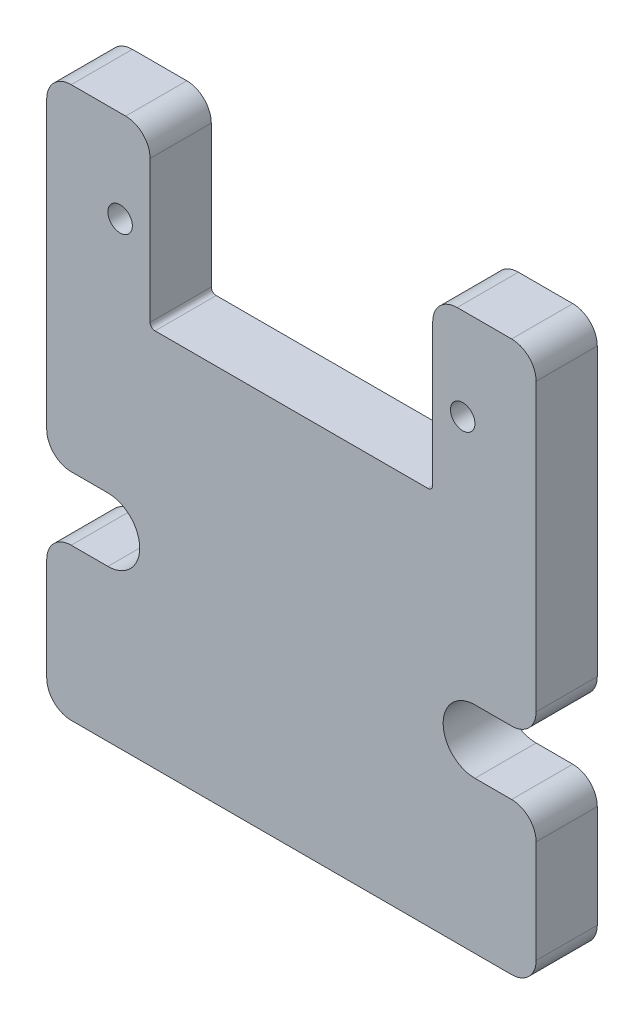
ISO-10303-21;
HEADER;
FILE_DESCRIPTION(('STEP AP214'),'2;1');
FILE_NAME('part.step','',(''),(''),'','','');
FILE_SCHEMA(('AUTOMOTIVE_DESIGN { 1 0 10303 214 1 1 1 1 }'));
ENDSEC;
DATA;
#1=APPLICATION_CONTEXT('core data for automotive mechanical design processes');
#2=APPLICATION_PROTOCOL_DEFINITION('international standard','automotive_design',2000,#1);
#3=PRODUCT_CONTEXT('',#1,'mechanical');
#4=PRODUCT('Part','Part','',(#3));
#5=PRODUCT_RELATED_PRODUCT_CATEGORY('part','',(#4));
#6=PRODUCT_DEFINITION_FORMATION('','',#4);
#7=PRODUCT_DEFINITION_CONTEXT('part definition',#1,'design');
#8=PRODUCT_DEFINITION('design','',#6,#7);
#9=PRODUCT_DEFINITION_SHAPE('','',#8);
#10=(LENGTH_UNIT() NAMED_UNIT(*) SI_UNIT(.MILLI.,.METRE.));
#11=(NAMED_UNIT(*) PLANE_ANGLE_UNIT() SI_UNIT($,.RADIAN.));
#12=(NAMED_UNIT(*) SI_UNIT($,.STERADIAN.) SOLID_ANGLE_UNIT());
#13=UNCERTAINTY_MEASURE_WITH_UNIT(LENGTH_MEASURE(1.E-05),#10,'distance_accuracy_value','');
#14=(GEOMETRIC_REPRESENTATION_CONTEXT(3) GLOBAL_UNCERTAINTY_ASSIGNED_CONTEXT((#13)) GLOBAL_UNIT_ASSIGNED_CONTEXT((#10,
#11,#12)) REPRESENTATION_CONTEXT('',''));
#15=CARTESIAN_POINT('',(0.,0.,0.));
#16=DIRECTION('',(0.,0.,1.));
#17=DIRECTION('',(1.,0.,0.));
#18=AXIS2_PLACEMENT_3D('',#15,#16,#17);
#19=CARTESIAN_POINT('',(40.,0.,5.));
#20=DIRECTION('',(-1.,0.,0.));
#21=DIRECTION('',(0.,-1.,0.));
#22=AXIS2_PLACEMENT_3D('',#19,#20,#21);
#23=PLANE('',#22);
#24=DIRECTION('',(0.,1.,0.));
#25=VECTOR('',#24,1.);
#26=CARTESIAN_POINT('',(40.,0.,0.));
#27=LINE('',#26,#25);
#28=CARTESIAN_POINT('',(40.,34.6,0.));
#29=VERTEX_POINT('',#28);
#30=CARTESIAN_POINT('',(40.,58.,0.));
#31=VERTEX_POINT('',#30);
#32=EDGE_CURVE('E276',#29,#31,#27,.T.);
#33=ORIENTED_EDGE('',*,*,#32,.T.);
#34=DIRECTION('',(0.,0.,-1.));
#35=VECTOR('',#34,1.);
#36=CARTESIAN_POINT('',(40.,58.,5.));
#37=LINE('',#36,#35);
#38=CARTESIAN_POINT('',(40.,58.,5.));
#39=VERTEX_POINT('',#38);
#40=EDGE_CURVE('E334',#31,#39,#37,.F.);
#41=ORIENTED_EDGE('',*,*,#40,.T.);
#42=DIRECTION('',(0.,1.,0.));
#43=VECTOR('',#42,1.);
#44=CARTESIAN_POINT('',(40.,0.,5.));
#45=LINE('',#44,#43);
#46=CARTESIAN_POINT('',(40.,34.6,5.));
#47=VERTEX_POINT('',#46);
#48=EDGE_CURVE('E269',#47,#39,#45,.T.);
#49=ORIENTED_EDGE('',*,*,#48,.F.);
#50=DIRECTION('',(0.,0.,1.));
#51=VECTOR('',#50,1.);
#52=CARTESIAN_POINT('',(40.,34.6,5.));
#53=LINE('',#52,#51);
#54=EDGE_CURVE('E332',#47,#29,#53,.F.);
#55=ORIENTED_EDGE('',*,*,#54,.T.);
#56=EDGE_LOOP('',(#33,#41,#49,#55));
#57=FACE_BOUND('',#56,.T.);
#58=ADVANCED_FACE('F33',(#57),#23,.F.);
#59=CARTESIAN_POINT('',(0.,60.,5.));
#60=DIRECTION('',(0.,-1.,0.));
#61=DIRECTION('',(1.,0.,0.));
#62=AXIS2_PLACEMENT_3D('',#59,#60,#61);
#63=PLANE('',#62);
#64=DIRECTION('',(-1.,0.,0.));
#65=VECTOR('',#64,1.);
#66=CARTESIAN_POINT('',(0.,60.,5.));
#67=LINE('',#66,#65);
#68=CARTESIAN_POINT('',(6.45,60.,5.));
#69=VERTEX_POINT('',#68);
#70=CARTESIAN_POINT('',(2.,60.,5.));
#71=VERTEX_POINT('',#70);
#72=EDGE_CURVE('E268',#69,#71,#67,.T.);
#73=ORIENTED_EDGE('',*,*,#72,.F.);
#74=DIRECTION('',(0.,0.,1.));
#75=VECTOR('',#74,1.);
#76=CARTESIAN_POINT('',(6.45,60.,5.));
#77=LINE('',#76,#75);
#78=CARTESIAN_POINT('',(6.45,60.,0.));
#79=VERTEX_POINT('',#78);
#80=EDGE_CURVE('E321',#69,#79,#77,.F.);
#81=ORIENTED_EDGE('',*,*,#80,.T.);
#82=DIRECTION('',(-1.,0.,0.));
#83=VECTOR('',#82,1.);
#84=CARTESIAN_POINT('',(0.,60.,0.));
#85=LINE('',#84,#83);
#86=CARTESIAN_POINT('',(2.,60.,0.));
#87=VERTEX_POINT('',#86);
#88=EDGE_CURVE('E282',#79,#87,#85,.T.);
#89=ORIENTED_EDGE('',*,*,#88,.T.);
#90=DIRECTION('',(0.,0.,-1.));
#91=VECTOR('',#90,1.);
#92=CARTESIAN_POINT('',(2.,60.,5.));
#93=LINE('',#92,#91);
#94=EDGE_CURVE('E319',#87,#71,#93,.F.);
#95=ORIENTED_EDGE('',*,*,#94,.T.);
#96=EDGE_LOOP('',(#73,#81,#89,#95));
#97=FACE_BOUND('',#96,.T.);
#98=ADVANCED_FACE('F528',(#97),#63,.F.);
#99=CARTESIAN_POINT('',(0.,0.,5.));
#100=DIRECTION('',(1.,0.,0.));
#101=DIRECTION('',(0.,0.,-1.));
#102=AXIS2_PLACEMENT_3D('',#99,#100,#101);
#103=PLANE('',#102);
#104=DIRECTION('',(0.,-1.,0.));
#105=VECTOR('',#104,1.);
#106=CARTESIAN_POINT('',(0.,0.,0.));
#107=LINE('',#106,#105);
#108=CARTESIAN_POINT('',(0.,25.4,0.));
#109=VERTEX_POINT('',#108);
#110=CARTESIAN_POINT('',(0.,17.,0.));
#111=VERTEX_POINT('',#110);
#112=EDGE_CURVE('E258',#109,#111,#107,.T.);
#113=ORIENTED_EDGE('',*,*,#112,.T.);
#114=DIRECTION('',(0.,0.,1.));
#115=VECTOR('',#114,1.);
#116=CARTESIAN_POINT('',(0.,17.,5.));
#117=LINE('',#116,#115);
#118=CARTESIAN_POINT('',(0.,17.,5.));
#119=VERTEX_POINT('',#118);
#120=EDGE_CURVE('E374',#111,#119,#117,.T.);
#121=ORIENTED_EDGE('',*,*,#120,.T.);
#122=DIRECTION('',(0.,-1.,0.));
#123=VECTOR('',#122,1.);
#124=CARTESIAN_POINT('',(0.,0.,5.));
#125=LINE('',#124,#123);
#126=CARTESIAN_POINT('',(0.,25.4,5.));
#127=VERTEX_POINT('',#126);
#128=EDGE_CURVE('E261',#127,#119,#125,.T.);
#129=ORIENTED_EDGE('',*,*,#128,.F.);
#130=DIRECTION('',(0.,0.,1.));
#131=VECTOR('',#130,1.);
#132=CARTESIAN_POINT('',(0.,25.4,5.));
#133=LINE('',#132,#131);
#134=EDGE_CURVE('E343',#127,#109,#133,.F.);
#135=ORIENTED_EDGE('',*,*,#134,.T.);
#136=EDGE_LOOP('',(#113,#121,#129,#135));
#137=FACE_BOUND('',#136,.T.);
#138=ADVANCED_FACE('F395',(#137),#103,.F.);
#139=CARTESIAN_POINT('',(0.,0.,5.));
#140=DIRECTION('',(0.,0.,-1.));
#141=DIRECTION('',(-1.,0.,0.));
#142=AXIS2_PLACEMENT_3D('',#139,#140,#141);
#143=PLANE('',#142);
#144=CARTESIAN_POINT('',(6.00000000000001,52.5,5.));
#145=DIRECTION('',(0.,0.,1.));
#146=DIRECTION('',(1.,0.,0.));
#147=AXIS2_PLACEMENT_3D('',#144,#145,#146);
#148=CIRCLE('',#147,1.);
#149=CARTESIAN_POINT('',(7.00000000000001,52.5,5.));
#150=VERTEX_POINT('',#149);
#151=EDGE_CURVE('E408',#150,#150,#148,.T.);
#152=ORIENTED_EDGE('',*,*,#151,.F.);
#153=EDGE_LOOP('',(#152));
#154=FACE_BOUND('',#153,.T.);
#155=CARTESIAN_POINT('',(34.,52.5,5.));
#156=DIRECTION('',(0.,0.,1.));
#157=DIRECTION('',(1.,0.,0.));
#158=AXIS2_PLACEMENT_3D('',#155,#156,#157);
#159=CIRCLE('',#158,0.999999999999998);
#160=CARTESIAN_POINT('',(35.,52.5,5.));
#161=VERTEX_POINT('',#160);
#162=EDGE_CURVE('E414',#161,#161,#159,.T.);
#163=ORIENTED_EDGE('',*,*,#162,.F.);
#164=EDGE_LOOP('',(#163));
#165=FACE_BOUND('',#164,.T.);
#166=ORIENTED_EDGE('',*,*,#128,.T.);
#167=CARTESIAN_POINT('',(2.,17.,5.));
#168=DIRECTION('',(0.,0.,-1.));
#169=DIRECTION('',(-1.,0.,0.));
#170=AXIS2_PLACEMENT_3D('',#167,#168,#169);
#171=CIRCLE('',#170,2.);
#172=CARTESIAN_POINT('',(2.,15.,5.));
#173=VERTEX_POINT('',#172);
#174=EDGE_CURVE('E379',#119,#173,#171,.F.);
#175=ORIENTED_EDGE('',*,*,#174,.T.);
#176=DIRECTION('',(-1.,0.,0.));
#177=VECTOR('',#176,1.);
#178=CARTESIAN_POINT('',(40.,15.,5.));
#179=LINE('',#178,#177);
#180=CARTESIAN_POINT('',(38.,15.,5.));
#181=VERTEX_POINT('',#180);
#182=EDGE_CURVE('E403',#181,#173,#179,.T.);
#183=ORIENTED_EDGE('',*,*,#182,.F.);
#184=CARTESIAN_POINT('',(38.,17.,5.));
#185=DIRECTION('',(0.,0.,-1.));
#186=DIRECTION('',(-1.,0.,0.));
#187=AXIS2_PLACEMENT_3D('',#184,#185,#186);
#188=CIRCLE('',#187,2.);
#189=CARTESIAN_POINT('',(40.,17.,5.));
#190=VERTEX_POINT('',#189);
#191=EDGE_CURVE('E377',#181,#190,#188,.F.);
#192=ORIENTED_EDGE('',*,*,#191,.T.);
#193=CARTESIAN_POINT('',(40.,25.4,5.));
#194=VERTEX_POINT('',#193);
#195=EDGE_CURVE('E266',#190,#194,#45,.T.);
#196=ORIENTED_EDGE('',*,*,#195,.T.);
#197=CARTESIAN_POINT('',(38.,25.4,5.));
#198=DIRECTION('',(0.,0.,-1.));
#199=DIRECTION('',(-1.,0.,0.));
#200=AXIS2_PLACEMENT_3D('',#197,#198,#199);
#201=CIRCLE('',#200,2.);
#202=CARTESIAN_POINT('',(38.,27.4,5.));
#203=VERTEX_POINT('',#202);
#204=EDGE_CURVE('E289',#194,#203,#201,.F.);
#205=ORIENTED_EDGE('',*,*,#204,.T.);
#206=DIRECTION('',(1.,0.,0.));
#207=VECTOR('',#206,1.);
#208=CARTESIAN_POINT('',(35.,27.4,5.));
#209=LINE('',#208,#207);
#210=CARTESIAN_POINT('',(35.,27.4,5.));
#211=VERTEX_POINT('',#210);
#212=EDGE_CURVE('E424',#211,#203,#209,.T.);
#213=ORIENTED_EDGE('',*,*,#212,.F.);
#214=CARTESIAN_POINT('',(35.,30.,5.));
#215=DIRECTION('',(0.,0.,1.));
#216=DIRECTION('',(1.,0.,0.));
#217=AXIS2_PLACEMENT_3D('',#214,#215,#216);
#218=CIRCLE('',#217,2.6);
#219=CARTESIAN_POINT('',(35.,32.6,5.));
#220=VERTEX_POINT('',#219);
#221=EDGE_CURVE('E245',#220,#211,#218,.T.);
#222=ORIENTED_EDGE('',*,*,#221,.F.);
#223=DIRECTION('',(-1.,0.,0.));
#224=VECTOR('',#223,1.);
#225=CARTESIAN_POINT('',(35.,32.6,5.));
#226=LINE('',#225,#224);
#227=CARTESIAN_POINT('',(38.,32.6,5.));
#228=VERTEX_POINT('',#227);
#229=EDGE_CURVE('E237',#228,#220,#226,.T.);
#230=ORIENTED_EDGE('',*,*,#229,.F.);
#231=CARTESIAN_POINT('',(38.,34.6,5.));
#232=DIRECTION('',(0.,0.,-1.));
#233=DIRECTION('',(-1.,0.,0.));
#234=AXIS2_PLACEMENT_3D('',#231,#232,#233);
#235=CIRCLE('',#234,2.);
#236=EDGE_CURVE('E291',#228,#47,#235,.F.);
#237=ORIENTED_EDGE('',*,*,#236,.T.);
#238=ORIENTED_EDGE('',*,*,#48,.T.);
#239=CARTESIAN_POINT('',(38.,58.,5.));
#240=DIRECTION('',(0.,0.,-1.));
#241=DIRECTION('',(-1.,0.,0.));
#242=AXIS2_PLACEMENT_3D('',#239,#240,#241);
#243=CIRCLE('',#242,2.);
#244=CARTESIAN_POINT('',(38.,60.,5.));
#245=VERTEX_POINT('',#244);
#246=EDGE_CURVE('E293',#39,#245,#243,.F.);
#247=ORIENTED_EDGE('',*,*,#246,.T.);
#248=CARTESIAN_POINT('',(33.55,60.,5.));
#249=VERTEX_POINT('',#248);
#250=EDGE_CURVE('E272',#245,#249,#67,.T.);
#251=ORIENTED_EDGE('',*,*,#250,.T.);
#252=CARTESIAN_POINT('',(33.55,58.,5.));
#253=DIRECTION('',(0.,0.,-1.));
#254=DIRECTION('',(-1.,0.,0.));
#255=AXIS2_PLACEMENT_3D('',#252,#253,#254);
#256=CIRCLE('',#255,2.);
#257=CARTESIAN_POINT('',(31.55,58.,5.));
#258=VERTEX_POINT('',#257);
#259=EDGE_CURVE('E295',#249,#258,#256,.F.);
#260=ORIENTED_EDGE('',*,*,#259,.T.);
#261=DIRECTION('',(0.,1.,0.));
#262=VECTOR('',#261,1.);
#263=CARTESIAN_POINT('',(31.55,60.,5.));
#264=LINE('',#263,#262);
#265=CARTESIAN_POINT('',(31.55,46.4,5.));
#266=VERTEX_POINT('',#265);
#267=EDGE_CURVE('E434',#266,#258,#264,.T.);
#268=ORIENTED_EDGE('',*,*,#267,.F.);
#269=CARTESIAN_POINT('',(31.15,46.4,5.));
#270=DIRECTION('',(0.,0.,-1.));
#271=DIRECTION('',(-1.,0.,0.));
#272=AXIS2_PLACEMENT_3D('',#269,#270,#271);
#273=CIRCLE('',#272,0.4);
#274=CARTESIAN_POINT('',(31.15,46.,5.));
#275=VERTEX_POINT('',#274);
#276=EDGE_CURVE('E366',#266,#275,#273,.T.);
#277=ORIENTED_EDGE('',*,*,#276,.T.);
#278=DIRECTION('',(1.,0.,0.));
#279=VECTOR('',#278,1.);
#280=CARTESIAN_POINT('',(8.45000000000001,46.,5.));
#281=LINE('',#280,#279);
#282=CARTESIAN_POINT('',(8.85,46.,5.));
#283=VERTEX_POINT('',#282);
#284=EDGE_CURVE('E440',#283,#275,#281,.T.);
#285=ORIENTED_EDGE('',*,*,#284,.F.);
#286=CARTESIAN_POINT('',(8.85,46.4,5.));
#287=DIRECTION('',(0.,0.,-1.));
#288=DIRECTION('',(-1.,0.,0.));
#289=AXIS2_PLACEMENT_3D('',#286,#287,#288);
#290=CIRCLE('',#289,0.4);
#291=CARTESIAN_POINT('',(8.45000000000001,46.4,5.));
#292=VERTEX_POINT('',#291);
#293=EDGE_CURVE('E370',#283,#292,#290,.T.);
#294=ORIENTED_EDGE('',*,*,#293,.T.);
#295=DIRECTION('',(0.,-1.,0.));
#296=VECTOR('',#295,1.);
#297=CARTESIAN_POINT('',(8.45,60.,5.));
#298=LINE('',#297,#296);
#299=CARTESIAN_POINT('',(8.45,58.,5.));
#300=VERTEX_POINT('',#299);
#301=EDGE_CURVE('E420',#300,#292,#298,.T.);
#302=ORIENTED_EDGE('',*,*,#301,.F.);
#303=CARTESIAN_POINT('',(6.45,58.,5.));
#304=DIRECTION('',(0.,0.,-1.));
#305=DIRECTION('',(-1.,0.,0.));
#306=AXIS2_PLACEMENT_3D('',#303,#304,#305);
#307=CIRCLE('',#306,2.);
#308=EDGE_CURVE('E298',#300,#69,#307,.F.);
#309=ORIENTED_EDGE('',*,*,#308,.T.);
#310=ORIENTED_EDGE('',*,*,#72,.T.);
#311=CARTESIAN_POINT('',(2.,58.,5.));
#312=DIRECTION('',(0.,0.,-1.));
#313=DIRECTION('',(-1.,0.,0.));
#314=AXIS2_PLACEMENT_3D('',#311,#312,#313);
#315=CIRCLE('',#314,2.);
#316=CARTESIAN_POINT('',(0.,58.,5.));
#317=VERTEX_POINT('',#316);
#318=EDGE_CURVE('E283',#71,#317,#315,.F.);
#319=ORIENTED_EDGE('',*,*,#318,.T.);
#320=CARTESIAN_POINT('',(0.,34.6,5.));
#321=VERTEX_POINT('',#320);
#322=EDGE_CURVE('E264',#317,#321,#125,.T.);
#323=ORIENTED_EDGE('',*,*,#322,.T.);
#324=CARTESIAN_POINT('',(2.,34.6,5.));
#325=DIRECTION('',(0.,0.,-1.));
#326=DIRECTION('',(-1.,0.,0.));
#327=AXIS2_PLACEMENT_3D('',#324,#325,#326);
#328=CIRCLE('',#327,2.);
#329=CARTESIAN_POINT('',(2.,32.6,5.));
#330=VERTEX_POINT('',#329);
#331=EDGE_CURVE('E285',#321,#330,#328,.F.);
#332=ORIENTED_EDGE('',*,*,#331,.T.);
#333=DIRECTION('',(-1.,0.,0.));
#334=VECTOR('',#333,1.);
#335=CARTESIAN_POINT('',(5.,32.6,5.));
#336=LINE('',#335,#334);
#337=CARTESIAN_POINT('',(5.,32.6,5.));
#338=VERTEX_POINT('',#337);
#339=EDGE_CURVE('E241',#338,#330,#336,.T.);
#340=ORIENTED_EDGE('',*,*,#339,.F.);
#341=CARTESIAN_POINT('',(5.,30.,5.));
#342=DIRECTION('',(0.,0.,1.));
#343=DIRECTION('',(1.,0.,0.));
#344=AXIS2_PLACEMENT_3D('',#341,#342,#343);
#345=CIRCLE('',#344,2.6);
#346=CARTESIAN_POINT('',(5.,27.4,5.));
#347=VERTEX_POINT('',#346);
#348=EDGE_CURVE('E255',#347,#338,#345,.T.);
#349=ORIENTED_EDGE('',*,*,#348,.F.);
#350=DIRECTION('',(1.,0.,0.));
#351=VECTOR('',#350,1.);
#352=CARTESIAN_POINT('',(5.,27.4,5.));
#353=LINE('',#352,#351);
#354=CARTESIAN_POINT('',(2.,27.4,5.));
#355=VERTEX_POINT('',#354);
#356=EDGE_CURVE('E448',#355,#347,#353,.T.);
#357=ORIENTED_EDGE('',*,*,#356,.F.);
#358=CARTESIAN_POINT('',(2.,25.4,5.));
#359=DIRECTION('',(0.,0.,-1.));
#360=DIRECTION('',(-1.,0.,0.));
#361=AXIS2_PLACEMENT_3D('',#358,#359,#360);
#362=CIRCLE('',#361,2.);
#363=EDGE_CURVE('E287',#355,#127,#362,.F.);
#364=ORIENTED_EDGE('',*,*,#363,.T.);
#365=EDGE_LOOP('',(#166,#175,#183,#192,#196,#205,#213,#222,#230,#237,#238,#247,#251,#260,#268,
#277,#285,#294,#302,#309,#310,#319,#323,#332,#340,#349,#357,#364));
#366=FACE_BOUND('',#365,.T.);
#367=ADVANCED_FACE('F402',(#154,#165,#366),#143,.F.);
#368=CARTESIAN_POINT('',(0.,0.,0.));
#369=DIRECTION('',(0.,0.,-1.));
#370=DIRECTION('',(-1.,0.,0.));
#371=AXIS2_PLACEMENT_3D('',#368,#369,#370);
#372=PLANE('',#371);
#373=DIRECTION('',(1.,0.,0.));
#374=VECTOR('',#373,1.);
#375=CARTESIAN_POINT('',(0.,15.,0.));
#376=LINE('',#375,#374);
#377=CARTESIAN_POINT('',(2.,15.,0.));
#378=VERTEX_POINT('',#377);
#379=CARTESIAN_POINT('',(38.,15.,0.));
#380=VERTEX_POINT('',#379);
#381=EDGE_CURVE('E390',#378,#380,#376,.T.);
#382=ORIENTED_EDGE('',*,*,#381,.F.);
#383=CARTESIAN_POINT('',(2.,17.,0.));
#384=DIRECTION('',(0.,0.,-1.));
#385=DIRECTION('',(-1.,0.,0.));
#386=AXIS2_PLACEMENT_3D('',#383,#384,#385);
#387=CIRCLE('',#386,2.);
#388=EDGE_CURVE('E41',#378,#111,#387,.T.);
#389=ORIENTED_EDGE('',*,*,#388,.T.);
#390=ORIENTED_EDGE('',*,*,#112,.F.);
#391=CARTESIAN_POINT('',(2.,25.4,0.));
#392=DIRECTION('',(0.,0.,-1.));
#393=DIRECTION('',(-1.,0.,0.));
#394=AXIS2_PLACEMENT_3D('',#391,#392,#393);
#395=CIRCLE('',#394,2.);
#396=CARTESIAN_POINT('',(2.,27.4,0.));
#397=VERTEX_POINT('',#396);
#398=EDGE_CURVE('E304',#109,#397,#395,.T.);
#399=ORIENTED_EDGE('',*,*,#398,.T.);
#400=DIRECTION('',(1.,0.,0.));
#401=VECTOR('',#400,1.);
#402=CARTESIAN_POINT('',(5.,27.4,0.));
#403=LINE('',#402,#401);
#404=CARTESIAN_POINT('',(5.,27.4,0.));
#405=VERTEX_POINT('',#404);
#406=EDGE_CURVE('E447',#397,#405,#403,.T.);
#407=ORIENTED_EDGE('',*,*,#406,.T.);
#408=CARTESIAN_POINT('',(5.,30.,0.));
#409=DIRECTION('',(0.,0.,1.));
#410=DIRECTION('',(1.,0.,0.));
#411=AXIS2_PLACEMENT_3D('',#408,#409,#410);
#412=CIRCLE('',#411,2.6);
#413=CARTESIAN_POINT('',(5.,32.6,0.));
#414=VERTEX_POINT('',#413);
#415=EDGE_CURVE('E248',#405,#414,#412,.T.);
#416=ORIENTED_EDGE('',*,*,#415,.T.);
#417=DIRECTION('',(-1.,0.,0.));
#418=VECTOR('',#417,1.);
#419=CARTESIAN_POINT('',(5.,32.6,0.));
#420=LINE('',#419,#418);
#421=CARTESIAN_POINT('',(2.,32.6,0.));
#422=VERTEX_POINT('',#421);
#423=EDGE_CURVE('E444',#414,#422,#420,.T.);
#424=ORIENTED_EDGE('',*,*,#423,.T.);
#425=CARTESIAN_POINT('',(2.,34.6,0.));
#426=DIRECTION('',(0.,0.,-1.));
#427=DIRECTION('',(-1.,0.,0.));
#428=AXIS2_PLACEMENT_3D('',#425,#426,#427);
#429=CIRCLE('',#428,2.);
#430=CARTESIAN_POINT('',(0.,34.6,0.));
#431=VERTEX_POINT('',#430);
#432=EDGE_CURVE('E302',#422,#431,#429,.T.);
#433=ORIENTED_EDGE('',*,*,#432,.T.);
#434=CARTESIAN_POINT('',(0.,58.,0.));
#435=VERTEX_POINT('',#434);
#436=EDGE_CURVE('E273',#435,#431,#107,.T.);
#437=ORIENTED_EDGE('',*,*,#436,.F.);
#438=CARTESIAN_POINT('',(2.,58.,0.));
#439=DIRECTION('',(0.,0.,-1.));
#440=DIRECTION('',(-1.,0.,0.));
#441=AXIS2_PLACEMENT_3D('',#438,#439,#440);
#442=CIRCLE('',#441,2.);
#443=EDGE_CURVE('E300',#435,#87,#442,.T.);
#444=ORIENTED_EDGE('',*,*,#443,.T.);
#445=ORIENTED_EDGE('',*,*,#88,.F.);
#446=CARTESIAN_POINT('',(6.45,58.,0.));
#447=DIRECTION('',(0.,0.,-1.));
#448=DIRECTION('',(-1.,0.,0.));
#449=AXIS2_PLACEMENT_3D('',#446,#447,#448);
#450=CIRCLE('',#449,2.);
#451=CARTESIAN_POINT('',(8.45,58.,0.));
#452=VERTEX_POINT('',#451);
#453=EDGE_CURVE('E314',#79,#452,#450,.T.);
#454=ORIENTED_EDGE('',*,*,#453,.T.);
#455=DIRECTION('',(0.,-1.,0.));
#456=VECTOR('',#455,1.);
#457=CARTESIAN_POINT('',(8.45,60.,0.));
#458=LINE('',#457,#456);
#459=CARTESIAN_POINT('',(8.45000000000001,46.4,0.));
#460=VERTEX_POINT('',#459);
#461=EDGE_CURVE('E430',#452,#460,#458,.T.);
#462=ORIENTED_EDGE('',*,*,#461,.T.);
#463=CARTESIAN_POINT('',(8.85,46.4,0.));
#464=DIRECTION('',(0.,0.,-1.));
#465=DIRECTION('',(-1.,0.,0.));
#466=AXIS2_PLACEMENT_3D('',#463,#464,#465);
#467=CIRCLE('',#466,0.4);
#468=CARTESIAN_POINT('',(8.85,46.,0.));
#469=VERTEX_POINT('',#468);
#470=EDGE_CURVE('E372',#460,#469,#467,.F.);
#471=ORIENTED_EDGE('',*,*,#470,.T.);
#472=DIRECTION('',(1.,0.,0.));
#473=VECTOR('',#472,1.);
#474=CARTESIAN_POINT('',(8.45000000000001,46.,0.));
#475=LINE('',#474,#473);
#476=CARTESIAN_POINT('',(31.15,46.,0.));
#477=VERTEX_POINT('',#476);
#478=EDGE_CURVE('E433',#469,#477,#475,.T.);
#479=ORIENTED_EDGE('',*,*,#478,.T.);
#480=CARTESIAN_POINT('',(31.15,46.4,0.));
#481=DIRECTION('',(0.,0.,-1.));
#482=DIRECTION('',(-1.,0.,0.));
#483=AXIS2_PLACEMENT_3D('',#480,#481,#482);
#484=CIRCLE('',#483,0.4);
#485=CARTESIAN_POINT('',(31.55,46.4,0.));
#486=VERTEX_POINT('',#485);
#487=EDGE_CURVE('E368',#477,#486,#484,.F.);
#488=ORIENTED_EDGE('',*,*,#487,.T.);
#489=DIRECTION('',(0.,1.,0.));
#490=VECTOR('',#489,1.);
#491=CARTESIAN_POINT('',(31.55,60.,0.));
#492=LINE('',#491,#490);
#493=CARTESIAN_POINT('',(31.55,58.,0.));
#494=VERTEX_POINT('',#493);
#495=EDGE_CURVE('E427',#486,#494,#492,.T.);
#496=ORIENTED_EDGE('',*,*,#495,.T.);
#497=CARTESIAN_POINT('',(33.55,58.,0.));
#498=DIRECTION('',(0.,0.,-1.));
#499=DIRECTION('',(-1.,0.,0.));
#500=AXIS2_PLACEMENT_3D('',#497,#498,#499);
#501=CIRCLE('',#500,2.);
#502=CARTESIAN_POINT('',(33.55,60.,0.));
#503=VERTEX_POINT('',#502);
#504=EDGE_CURVE('E312',#494,#503,#501,.T.);
#505=ORIENTED_EDGE('',*,*,#504,.T.);
#506=CARTESIAN_POINT('',(38.,60.,0.));
#507=VERTEX_POINT('',#506);
#508=EDGE_CURVE('E265',#507,#503,#85,.T.);
#509=ORIENTED_EDGE('',*,*,#508,.F.);
#510=CARTESIAN_POINT('',(38.,58.,0.));
#511=DIRECTION('',(0.,0.,-1.));
#512=DIRECTION('',(-1.,0.,0.));
#513=AXIS2_PLACEMENT_3D('',#510,#511,#512);
#514=CIRCLE('',#513,2.);
#515=EDGE_CURVE('E310',#507,#31,#514,.T.);
#516=ORIENTED_EDGE('',*,*,#515,.T.);
#517=ORIENTED_EDGE('',*,*,#32,.F.);
#518=CARTESIAN_POINT('',(38.,34.6,0.));
#519=DIRECTION('',(0.,0.,-1.));
#520=DIRECTION('',(-1.,0.,0.));
#521=AXIS2_PLACEMENT_3D('',#518,#519,#520);
#522=CIRCLE('',#521,2.);
#523=CARTESIAN_POINT('',(38.,32.6,0.));
#524=VERTEX_POINT('',#523);
#525=EDGE_CURVE('E226',#29,#524,#522,.T.);
#526=ORIENTED_EDGE('',*,*,#525,.T.);
#527=DIRECTION('',(-1.,0.,0.));
#528=VECTOR('',#527,1.);
#529=CARTESIAN_POINT('',(35.,32.6,0.));
#530=LINE('',#529,#528);
#531=CARTESIAN_POINT('',(35.,32.6,0.));
#532=VERTEX_POINT('',#531);
#533=EDGE_CURVE('E217',#524,#532,#530,.T.);
#534=ORIENTED_EDGE('',*,*,#533,.T.);
#535=CARTESIAN_POINT('',(35.,30.,0.));
#536=DIRECTION('',(0.,0.,1.));
#537=DIRECTION('',(1.,0.,0.));
#538=AXIS2_PLACEMENT_3D('',#535,#536,#537);
#539=CIRCLE('',#538,2.6);
#540=CARTESIAN_POINT('',(35.,27.4,0.));
#541=VERTEX_POINT('',#540);
#542=EDGE_CURVE('E223',#532,#541,#539,.T.);
#543=ORIENTED_EDGE('',*,*,#542,.T.);
#544=DIRECTION('',(1.,0.,0.));
#545=VECTOR('',#544,1.);
#546=CARTESIAN_POINT('',(35.,27.4,0.));
#547=LINE('',#546,#545);
#548=CARTESIAN_POINT('',(38.,27.4,0.));
#549=VERTEX_POINT('',#548);
#550=EDGE_CURVE('E231',#541,#549,#547,.T.);
#551=ORIENTED_EDGE('',*,*,#550,.T.);
#552=CARTESIAN_POINT('',(38.,25.4,0.));
#553=DIRECTION('',(0.,0.,-1.));
#554=DIRECTION('',(-1.,0.,0.));
#555=AXIS2_PLACEMENT_3D('',#552,#553,#554);
#556=CIRCLE('',#555,2.);
#557=CARTESIAN_POINT('',(40.,25.4,0.));
#558=VERTEX_POINT('',#557);
#559=EDGE_CURVE('E306',#549,#558,#556,.T.);
#560=ORIENTED_EDGE('',*,*,#559,.T.);
#561=CARTESIAN_POINT('',(40.,17.,0.));
#562=VERTEX_POINT('',#561);
#563=EDGE_CURVE('E279',#562,#558,#27,.T.);
#564=ORIENTED_EDGE('',*,*,#563,.F.);
#565=CARTESIAN_POINT('',(38.,17.,0.));
#566=DIRECTION('',(0.,0.,-1.));
#567=DIRECTION('',(-1.,0.,0.));
#568=AXIS2_PLACEMENT_3D('',#565,#566,#567);
#569=CIRCLE('',#568,2.);
#570=EDGE_CURVE('E53',#562,#380,#569,.T.);
#571=ORIENTED_EDGE('',*,*,#570,.T.);
#572=EDGE_LOOP('',(#382,#389,#390,#399,#407,#416,#424,#433,#437,#444,#445,#454,#462,#471,#479,
#488,#496,#505,#509,#516,#517,#526,#534,#543,#551,#560,#564,#571));
#573=FACE_BOUND('',#572,.T.);
#574=CARTESIAN_POINT('',(6.00000000000001,52.5,0.));
#575=DIRECTION('',(0.,0.,1.));
#576=DIRECTION('',(1.,0.,0.));
#577=AXIS2_PLACEMENT_3D('',#574,#575,#576);
#578=CIRCLE('',#577,1.);
#579=CARTESIAN_POINT('',(7.00000000000001,52.5,0.));
#580=VERTEX_POINT('',#579);
#581=EDGE_CURVE('E411',#580,#580,#578,.T.);
#582=ORIENTED_EDGE('',*,*,#581,.T.);
#583=EDGE_LOOP('',(#582));
#584=FACE_BOUND('',#583,.T.);
#585=CARTESIAN_POINT('',(34.,52.5,0.));
#586=DIRECTION('',(0.,0.,1.));
#587=DIRECTION('',(1.,0.,0.));
#588=AXIS2_PLACEMENT_3D('',#585,#586,#587);
#589=CIRCLE('',#588,0.999999999999998);
#590=CARTESIAN_POINT('',(35.,52.5,0.));
#591=VERTEX_POINT('',#590);
#592=EDGE_CURVE('E417',#591,#591,#589,.T.);
#593=ORIENTED_EDGE('',*,*,#592,.T.);
#594=EDGE_LOOP('',(#593));
#595=FACE_BOUND('',#594,.T.);
#596=ADVANCED_FACE('F219',(#573,#584,#595),#372,.T.);
#597=ORIENTED_EDGE('',*,*,#436,.T.);
#598=DIRECTION('',(0.,0.,1.));
#599=VECTOR('',#598,1.);
#600=CARTESIAN_POINT('',(0.,34.6,5.));
#601=LINE('',#600,#599);
#602=EDGE_CURVE('E351',#431,#321,#601,.T.);
#603=ORIENTED_EDGE('',*,*,#602,.T.);
#604=ORIENTED_EDGE('',*,*,#322,.F.);
#605=DIRECTION('',(0.,0.,-1.));
#606=VECTOR('',#605,1.);
#607=CARTESIAN_POINT('',(0.,58.,5.));
#608=LINE('',#607,#606);
#609=EDGE_CURVE('E348',#317,#435,#608,.T.);
#610=ORIENTED_EDGE('',*,*,#609,.T.);
#611=EDGE_LOOP('',(#597,#603,#604,#610));
#612=FACE_BOUND('',#611,.T.);
#613=ADVANCED_FACE('F477',(#612),#103,.F.);
#614=ORIENTED_EDGE('',*,*,#195,.F.);
#615=DIRECTION('',(0.,0.,1.));
#616=VECTOR('',#615,1.);
#617=CARTESIAN_POINT('',(40.,17.,5.));
#618=LINE('',#617,#616);
#619=EDGE_CURVE('E11',#190,#562,#618,.F.);
#620=ORIENTED_EDGE('',*,*,#619,.T.);
#621=ORIENTED_EDGE('',*,*,#563,.T.);
#622=DIRECTION('',(0.,0.,1.));
#623=VECTOR('',#622,1.);
#624=CARTESIAN_POINT('',(40.,25.4,5.));
#625=LINE('',#624,#623);
#626=EDGE_CURVE('E338',#558,#194,#625,.T.);
#627=ORIENTED_EDGE('',*,*,#626,.T.);
#628=EDGE_LOOP('',(#614,#620,#621,#627));
#629=FACE_BOUND('',#628,.T.);
#630=ADVANCED_FACE('F534',(#629),#23,.F.);
#631=ORIENTED_EDGE('',*,*,#508,.T.);
#632=DIRECTION('',(0.,0.,1.));
#633=VECTOR('',#632,1.);
#634=CARTESIAN_POINT('',(33.55,60.,5.));
#635=LINE('',#634,#633);
#636=EDGE_CURVE('E326',#503,#249,#635,.T.);
#637=ORIENTED_EDGE('',*,*,#636,.T.);
#638=ORIENTED_EDGE('',*,*,#250,.F.);
#639=DIRECTION('',(0.,0.,-1.));
#640=VECTOR('',#639,1.);
#641=CARTESIAN_POINT('',(38.,60.,5.));
#642=LINE('',#641,#640);
#643=EDGE_CURVE('E323',#245,#507,#642,.T.);
#644=ORIENTED_EDGE('',*,*,#643,.T.);
#645=EDGE_LOOP('',(#631,#637,#638,#644));
#646=FACE_BOUND('',#645,.T.);
#647=ADVANCED_FACE('F493',(#646),#63,.F.);
#648=CARTESIAN_POINT('',(5.,30.,5.));
#649=DIRECTION('',(0.,0.,-1.));
#650=DIRECTION('',(-1.,0.,0.));
#651=AXIS2_PLACEMENT_3D('',#648,#649,#650);
#652=CYLINDRICAL_SURFACE('',#651,2.6);
#653=DIRECTION('',(0.,0.,1.));
#654=VECTOR('',#653,1.);
#655=CARTESIAN_POINT('',(5.,27.4,0.));
#656=LINE('',#655,#654);
#657=EDGE_CURVE('E246',#405,#347,#656,.T.);
#658=ORIENTED_EDGE('',*,*,#657,.T.);
#659=ORIENTED_EDGE('',*,*,#348,.T.);
#660=DIRECTION('',(0.,0.,1.));
#661=VECTOR('',#660,1.);
#662=CARTESIAN_POINT('',(5.,32.6,0.));
#663=LINE('',#662,#661);
#664=EDGE_CURVE('E251',#414,#338,#663,.T.);
#665=ORIENTED_EDGE('',*,*,#664,.F.);
#666=ORIENTED_EDGE('',*,*,#415,.F.);
#667=EDGE_LOOP('',(#658,#659,#665,#666));
#668=FACE_BOUND('',#667,.T.);
#669=ADVANCED_FACE('F462',(#668),#652,.F.);
#670=CARTESIAN_POINT('',(35.,30.,5.));
#671=DIRECTION('',(0.,0.,-1.));
#672=DIRECTION('',(-1.,0.,0.));
#673=AXIS2_PLACEMENT_3D('',#670,#671,#672);
#674=CYLINDRICAL_SURFACE('',#673,2.6);
#675=DIRECTION('',(0.,0.,1.));
#676=VECTOR('',#675,1.);
#677=CARTESIAN_POINT('',(35.,32.6,0.));
#678=LINE('',#677,#676);
#679=EDGE_CURVE('E234',#532,#220,#678,.T.);
#680=ORIENTED_EDGE('',*,*,#679,.T.);
#681=ORIENTED_EDGE('',*,*,#221,.T.);
#682=DIRECTION('',(0.,0.,1.));
#683=VECTOR('',#682,1.);
#684=CARTESIAN_POINT('',(35.,27.4,0.));
#685=LINE('',#684,#683);
#686=EDGE_CURVE('E230',#541,#211,#685,.T.);
#687=ORIENTED_EDGE('',*,*,#686,.F.);
#688=ORIENTED_EDGE('',*,*,#542,.F.);
#689=EDGE_LOOP('',(#680,#681,#687,#688));
#690=FACE_BOUND('',#689,.T.);
#691=ADVANCED_FACE('F244',(#690),#674,.F.);
#692=CARTESIAN_POINT('',(5.,32.6,0.));
#693=DIRECTION('',(0.,1.,0.));
#694=DIRECTION('',(0.,0.,1.));
#695=AXIS2_PLACEMENT_3D('',#692,#693,#694);
#696=PLANE('',#695);
#697=ORIENTED_EDGE('',*,*,#339,.T.);
#698=DIRECTION('',(0.,0.,1.));
#699=VECTOR('',#698,1.);
#700=CARTESIAN_POINT('',(2.,32.6,0.));
#701=LINE('',#700,#699);
#702=EDGE_CURVE('E354',#330,#422,#701,.F.);
#703=ORIENTED_EDGE('',*,*,#702,.T.);
#704=ORIENTED_EDGE('',*,*,#423,.F.);
#705=ORIENTED_EDGE('',*,*,#664,.T.);
#706=EDGE_LOOP('',(#697,#703,#704,#705));
#707=FACE_BOUND('',#706,.T.);
#708=ADVANCED_FACE('F455',(#707),#696,.F.);
#709=CARTESIAN_POINT('',(5.,27.4,0.));
#710=DIRECTION('',(0.,-1.,0.));
#711=DIRECTION('',(1.,0.,0.));
#712=AXIS2_PLACEMENT_3D('',#709,#710,#711);
#713=PLANE('',#712);
#714=ORIENTED_EDGE('',*,*,#406,.F.);
#715=DIRECTION('',(0.,0.,1.));
#716=VECTOR('',#715,1.);
#717=CARTESIAN_POINT('',(2.,27.4,0.));
#718=LINE('',#717,#716);
#719=EDGE_CURVE('E345',#397,#355,#718,.T.);
#720=ORIENTED_EDGE('',*,*,#719,.T.);
#721=ORIENTED_EDGE('',*,*,#356,.T.);
#722=ORIENTED_EDGE('',*,*,#657,.F.);
#723=EDGE_LOOP('',(#714,#720,#721,#722));
#724=FACE_BOUND('',#723,.T.);
#725=ADVANCED_FACE('F466',(#724),#713,.F.);
#726=CARTESIAN_POINT('',(35.,27.4,0.));
#727=DIRECTION('',(0.,-1.,0.));
#728=DIRECTION('',(0.,0.,-1.));
#729=AXIS2_PLACEMENT_3D('',#726,#727,#728);
#730=PLANE('',#729);
#731=ORIENTED_EDGE('',*,*,#212,.T.);
#732=DIRECTION('',(0.,0.,1.));
#733=VECTOR('',#732,1.);
#734=CARTESIAN_POINT('',(38.,27.4,0.));
#735=LINE('',#734,#733);
#736=EDGE_CURVE('E341',#203,#549,#735,.F.);
#737=ORIENTED_EDGE('',*,*,#736,.T.);
#738=ORIENTED_EDGE('',*,*,#550,.F.);
#739=ORIENTED_EDGE('',*,*,#686,.T.);
#740=EDGE_LOOP('',(#731,#737,#738,#739));
#741=FACE_BOUND('',#740,.T.);
#742=ADVANCED_FACE('F543',(#741),#730,.F.);
#743=CARTESIAN_POINT('',(35.,32.6,0.));
#744=DIRECTION('',(0.,1.,0.));
#745=DIRECTION('',(0.,0.,1.));
#746=AXIS2_PLACEMENT_3D('',#743,#744,#745);
#747=PLANE('',#746);
#748=ORIENTED_EDGE('',*,*,#533,.F.);
#749=DIRECTION('',(0.,0.,1.));
#750=VECTOR('',#749,1.);
#751=CARTESIAN_POINT('',(38.,32.6,0.));
#752=LINE('',#751,#750);
#753=EDGE_CURVE('E336',#524,#228,#752,.T.);
#754=ORIENTED_EDGE('',*,*,#753,.T.);
#755=ORIENTED_EDGE('',*,*,#229,.T.);
#756=ORIENTED_EDGE('',*,*,#679,.F.);
#757=EDGE_LOOP('',(#748,#754,#755,#756));
#758=FACE_BOUND('',#757,.T.);
#759=ADVANCED_FACE('F235',(#758),#747,.F.);
#760=CARTESIAN_POINT('',(8.45,60.,0.));
#761=DIRECTION('',(-1.,0.,0.));
#762=DIRECTION('',(0.,-1.,0.));
#763=AXIS2_PLACEMENT_3D('',#760,#761,#762);
#764=PLANE('',#763);
#765=ORIENTED_EDGE('',*,*,#301,.T.);
#766=DIRECTION('',(0.,0.,1.));
#767=VECTOR('',#766,1.);
#768=CARTESIAN_POINT('',(8.45000000000001,46.4,0.));
#769=LINE('',#768,#767);
#770=EDGE_CURVE('E364',#292,#460,#769,.F.);
#771=ORIENTED_EDGE('',*,*,#770,.T.);
#772=ORIENTED_EDGE('',*,*,#461,.F.);
#773=DIRECTION('',(0.,0.,1.));
#774=VECTOR('',#773,1.);
#775=CARTESIAN_POINT('',(8.45,58.,0.));
#776=LINE('',#775,#774);
#777=EDGE_CURVE('E316',#452,#300,#776,.T.);
#778=ORIENTED_EDGE('',*,*,#777,.T.);
#779=EDGE_LOOP('',(#765,#771,#772,#778));
#780=FACE_BOUND('',#779,.T.);
#781=ADVANCED_FACE('F520',(#780),#764,.F.);
#782=CARTESIAN_POINT('',(31.55,60.,0.));
#783=DIRECTION('',(1.,0.,0.));
#784=DIRECTION('',(0.,1.,0.));
#785=AXIS2_PLACEMENT_3D('',#782,#783,#784);
#786=PLANE('',#785);
#787=ORIENTED_EDGE('',*,*,#495,.F.);
#788=DIRECTION('',(0.,0.,1.));
#789=VECTOR('',#788,1.);
#790=CARTESIAN_POINT('',(31.55,46.4,5.));
#791=LINE('',#790,#789);
#792=EDGE_CURVE('E356',#486,#266,#791,.T.);
#793=ORIENTED_EDGE('',*,*,#792,.T.);
#794=ORIENTED_EDGE('',*,*,#267,.T.);
#795=DIRECTION('',(0.,0.,1.));
#796=VECTOR('',#795,1.);
#797=CARTESIAN_POINT('',(31.55,58.,0.));
#798=LINE('',#797,#796);
#799=EDGE_CURVE('E329',#258,#494,#798,.F.);
#800=ORIENTED_EDGE('',*,*,#799,.T.);
#801=EDGE_LOOP('',(#787,#793,#794,#800));
#802=FACE_BOUND('',#801,.T.);
#803=ADVANCED_FACE('F503',(#802),#786,.F.);
#804=CARTESIAN_POINT('',(8.45000000000001,46.,0.));
#805=DIRECTION('',(0.,-1.,0.));
#806=DIRECTION('',(0.,0.,-1.));
#807=AXIS2_PLACEMENT_3D('',#804,#805,#806);
#808=PLANE('',#807);
#809=ORIENTED_EDGE('',*,*,#284,.T.);
#810=DIRECTION('',(0.,0.,1.));
#811=VECTOR('',#810,1.);
#812=CARTESIAN_POINT('',(31.15,46.,0.));
#813=LINE('',#812,#811);
#814=EDGE_CURVE('E362',#275,#477,#813,.F.);
#815=ORIENTED_EDGE('',*,*,#814,.T.);
#816=ORIENTED_EDGE('',*,*,#478,.F.);
#817=DIRECTION('',(0.,0.,1.));
#818=VECTOR('',#817,1.);
#819=CARTESIAN_POINT('',(8.85,46.,5.));
#820=LINE('',#819,#818);
#821=EDGE_CURVE('E359',#469,#283,#820,.T.);
#822=ORIENTED_EDGE('',*,*,#821,.T.);
#823=EDGE_LOOP('',(#809,#815,#816,#822));
#824=FACE_BOUND('',#823,.T.);
#825=ADVANCED_FACE('F511',(#824),#808,.F.);
#826=CARTESIAN_POINT('',(6.45,58.,0.));
#827=DIRECTION('',(0.,0.,1.));
#828=DIRECTION('',(1.,0.,0.));
#829=AXIS2_PLACEMENT_3D('',#826,#827,#828);
#830=CYLINDRICAL_SURFACE('',#829,2.);
#831=ORIENTED_EDGE('',*,*,#453,.F.);
#832=ORIENTED_EDGE('',*,*,#80,.F.);
#833=ORIENTED_EDGE('',*,*,#308,.F.);
#834=ORIENTED_EDGE('',*,*,#777,.F.);
#835=EDGE_LOOP('',(#831,#832,#833,#834));
#836=FACE_BOUND('',#835,.T.);
#837=ADVANCED_FACE('F524',(#836),#830,.T.);
#838=CARTESIAN_POINT('',(33.55,58.,5.));
#839=DIRECTION('',(0.,0.,1.));
#840=DIRECTION('',(1.,0.,0.));
#841=AXIS2_PLACEMENT_3D('',#838,#839,#840);
#842=CYLINDRICAL_SURFACE('',#841,2.);
#843=ORIENTED_EDGE('',*,*,#504,.F.);
#844=ORIENTED_EDGE('',*,*,#799,.F.);
#845=ORIENTED_EDGE('',*,*,#259,.F.);
#846=ORIENTED_EDGE('',*,*,#636,.F.);
#847=EDGE_LOOP('',(#843,#844,#845,#846));
#848=FACE_BOUND('',#847,.T.);
#849=ADVANCED_FACE('F499',(#848),#842,.T.);
#850=CARTESIAN_POINT('',(38.,58.,5.));
#851=DIRECTION('',(0.,0.,-1.));
#852=DIRECTION('',(-1.,0.,0.));
#853=AXIS2_PLACEMENT_3D('',#850,#851,#852);
#854=CYLINDRICAL_SURFACE('',#853,2.);
#855=ORIENTED_EDGE('',*,*,#246,.F.);
#856=ORIENTED_EDGE('',*,*,#40,.F.);
#857=ORIENTED_EDGE('',*,*,#515,.F.);
#858=ORIENTED_EDGE('',*,*,#643,.F.);
#859=EDGE_LOOP('',(#855,#856,#857,#858));
#860=FACE_BOUND('',#859,.T.);
#861=ADVANCED_FACE('F490',(#860),#854,.T.);
#862=CARTESIAN_POINT('',(38.,34.6,0.));
#863=DIRECTION('',(0.,0.,1.));
#864=DIRECTION('',(1.,0.,0.));
#865=AXIS2_PLACEMENT_3D('',#862,#863,#864);
#866=CYLINDRICAL_SURFACE('',#865,2.);
#867=ORIENTED_EDGE('',*,*,#525,.F.);
#868=ORIENTED_EDGE('',*,*,#54,.F.);
#869=ORIENTED_EDGE('',*,*,#236,.F.);
#870=ORIENTED_EDGE('',*,*,#753,.F.);
#871=EDGE_LOOP('',(#867,#868,#869,#870));
#872=FACE_BOUND('',#871,.T.);
#873=ADVANCED_FACE('F621',(#872),#866,.T.);
#874=CARTESIAN_POINT('',(38.,25.4,5.));
#875=DIRECTION('',(0.,0.,1.));
#876=DIRECTION('',(1.,0.,0.));
#877=AXIS2_PLACEMENT_3D('',#874,#875,#876);
#878=CYLINDRICAL_SURFACE('',#877,2.);
#879=ORIENTED_EDGE('',*,*,#559,.F.);
#880=ORIENTED_EDGE('',*,*,#736,.F.);
#881=ORIENTED_EDGE('',*,*,#204,.F.);
#882=ORIENTED_EDGE('',*,*,#626,.F.);
#883=EDGE_LOOP('',(#879,#880,#881,#882));
#884=FACE_BOUND('',#883,.T.);
#885=ADVANCED_FACE('F540',(#884),#878,.T.);
#886=CARTESIAN_POINT('',(2.,25.4,0.));
#887=DIRECTION('',(0.,0.,1.));
#888=DIRECTION('',(1.,0.,0.));
#889=AXIS2_PLACEMENT_3D('',#886,#887,#888);
#890=CYLINDRICAL_SURFACE('',#889,2.);
#891=ORIENTED_EDGE('',*,*,#398,.F.);
#892=ORIENTED_EDGE('',*,*,#134,.F.);
#893=ORIENTED_EDGE('',*,*,#363,.F.);
#894=ORIENTED_EDGE('',*,*,#719,.F.);
#895=EDGE_LOOP('',(#891,#892,#893,#894));
#896=FACE_BOUND('',#895,.T.);
#897=ADVANCED_FACE('F469',(#896),#890,.T.);
#898=CARTESIAN_POINT('',(2.,34.6,5.));
#899=DIRECTION('',(0.,0.,1.));
#900=DIRECTION('',(1.,0.,0.));
#901=AXIS2_PLACEMENT_3D('',#898,#899,#900);
#902=CYLINDRICAL_SURFACE('',#901,2.);
#903=ORIENTED_EDGE('',*,*,#432,.F.);
#904=ORIENTED_EDGE('',*,*,#702,.F.);
#905=ORIENTED_EDGE('',*,*,#331,.F.);
#906=ORIENTED_EDGE('',*,*,#602,.F.);
#907=EDGE_LOOP('',(#903,#904,#905,#906));
#908=FACE_BOUND('',#907,.T.);
#909=ADVANCED_FACE('F474',(#908),#902,.T.);
#910=CARTESIAN_POINT('',(2.,58.,5.));
#911=DIRECTION('',(0.,0.,-1.));
#912=DIRECTION('',(-1.,0.,0.));
#913=AXIS2_PLACEMENT_3D('',#910,#911,#912);
#914=CYLINDRICAL_SURFACE('',#913,2.);
#915=ORIENTED_EDGE('',*,*,#318,.F.);
#916=ORIENTED_EDGE('',*,*,#94,.F.);
#917=ORIENTED_EDGE('',*,*,#443,.F.);
#918=ORIENTED_EDGE('',*,*,#609,.F.);
#919=EDGE_LOOP('',(#915,#916,#917,#918));
#920=FACE_BOUND('',#919,.T.);
#921=ADVANCED_FACE('F533',(#920),#914,.T.);
#922=CARTESIAN_POINT('',(31.15,46.4,0.));
#923=DIRECTION('',(0.,0.,-1.));
#924=DIRECTION('',(-1.,0.,0.));
#925=AXIS2_PLACEMENT_3D('',#922,#923,#924);
#926=CYLINDRICAL_SURFACE('',#925,0.4);
#927=ORIENTED_EDGE('',*,*,#487,.F.);
#928=ORIENTED_EDGE('',*,*,#814,.F.);
#929=ORIENTED_EDGE('',*,*,#276,.F.);
#930=ORIENTED_EDGE('',*,*,#792,.F.);
#931=EDGE_LOOP('',(#927,#928,#929,#930));
#932=FACE_BOUND('',#931,.T.);
#933=ADVANCED_FACE('F507',(#932),#926,.F.);
#934=CARTESIAN_POINT('',(8.85,46.4,0.));
#935=DIRECTION('',(0.,0.,-1.));
#936=DIRECTION('',(-1.,0.,0.));
#937=AXIS2_PLACEMENT_3D('',#934,#935,#936);
#938=CYLINDRICAL_SURFACE('',#937,0.4);
#939=ORIENTED_EDGE('',*,*,#470,.F.);
#940=ORIENTED_EDGE('',*,*,#770,.F.);
#941=ORIENTED_EDGE('',*,*,#293,.F.);
#942=ORIENTED_EDGE('',*,*,#821,.F.);
#943=EDGE_LOOP('',(#939,#940,#941,#942));
#944=FACE_BOUND('',#943,.T.);
#945=ADVANCED_FACE('F517',(#944),#938,.F.);
#946=CARTESIAN_POINT('',(34.,52.5,0.));
#947=DIRECTION('',(0.,0.,1.));
#948=DIRECTION('',(1.,0.,0.));
#949=AXIS2_PLACEMENT_3D('',#946,#947,#948);
#950=CYLINDRICAL_SURFACE('',#949,0.999999999999998);
#951=ORIENTED_EDGE('',*,*,#592,.F.);
#952=EDGE_LOOP('',(#951));
#953=FACE_BOUND('',#952,.T.);
#954=ORIENTED_EDGE('',*,*,#162,.T.);
#955=EDGE_LOOP('',(#954));
#956=FACE_BOUND('',#955,.T.);
#957=ADVANCED_FACE('F664',(#953,#956),#950,.F.);
#958=CARTESIAN_POINT('',(6.00000000000001,52.5,0.));
#959=DIRECTION('',(0.,0.,1.));
#960=DIRECTION('',(1.,0.,0.));
#961=AXIS2_PLACEMENT_3D('',#958,#959,#960);
#962=CYLINDRICAL_SURFACE('',#961,1.);
#963=ORIENTED_EDGE('',*,*,#581,.F.);
#964=EDGE_LOOP('',(#963));
#965=FACE_BOUND('',#964,.T.);
#966=ORIENTED_EDGE('',*,*,#151,.T.);
#967=EDGE_LOOP('',(#966));
#968=FACE_BOUND('',#967,.T.);
#969=ADVANCED_FACE('F671',(#965,#968),#962,.F.);
#970=CARTESIAN_POINT('',(40.,15.,-5.));
#971=DIRECTION('',(0.,1.,0.));
#972=DIRECTION('',(0.,0.,1.));
#973=AXIS2_PLACEMENT_3D('',#970,#971,#972);
#974=PLANE('',#973);
#975=ORIENTED_EDGE('',*,*,#182,.T.);
#976=DIRECTION('',(0.,0.,1.));
#977=VECTOR('',#976,1.);
#978=CARTESIAN_POINT('',(2.,15.,-5.));
#979=LINE('',#978,#977);
#980=EDGE_CURVE('E384',#173,#378,#979,.F.);
#981=ORIENTED_EDGE('',*,*,#980,.T.);
#982=ORIENTED_EDGE('',*,*,#381,.T.);
#983=DIRECTION('',(0.,0.,1.));
#984=VECTOR('',#983,1.);
#985=CARTESIAN_POINT('',(38.,15.,-5.));
#986=LINE('',#985,#984);
#987=EDGE_CURVE('E381',#380,#181,#986,.T.);
#988=ORIENTED_EDGE('',*,*,#987,.T.);
#989=EDGE_LOOP('',(#975,#981,#982,#988));
#990=FACE_BOUND('',#989,.T.);
#991=ADVANCED_FACE('F405',(#990),#974,.F.);
#992=CARTESIAN_POINT('',(2.,17.,5.));
#993=DIRECTION('',(0.,0.,1.));
#994=DIRECTION('',(1.,0.,0.));
#995=AXIS2_PLACEMENT_3D('',#992,#993,#994);
#996=CYLINDRICAL_SURFACE('',#995,2.);
#997=ORIENTED_EDGE('',*,*,#388,.F.);
#998=ORIENTED_EDGE('',*,*,#980,.F.);
#999=ORIENTED_EDGE('',*,*,#174,.F.);
#1000=ORIENTED_EDGE('',*,*,#120,.F.);
#1001=EDGE_LOOP('',(#997,#998,#999,#1000));
#1002=FACE_BOUND('',#1001,.T.);
#1003=ADVANCED_FACE('F398',(#1002),#996,.T.);
#1004=CARTESIAN_POINT('',(38.,17.,-5.));
#1005=DIRECTION('',(0.,0.,1.));
#1006=DIRECTION('',(1.,0.,0.));
#1007=AXIS2_PLACEMENT_3D('',#1004,#1005,#1006);
#1008=CYLINDRICAL_SURFACE('',#1007,2.);
#1009=ORIENTED_EDGE('',*,*,#570,.F.);
#1010=ORIENTED_EDGE('',*,*,#619,.F.);
#1011=ORIENTED_EDGE('',*,*,#191,.F.);
#1012=ORIENTED_EDGE('',*,*,#987,.F.);
#1013=EDGE_LOOP('',(#1009,#1010,#1011,#1012));
#1014=FACE_BOUND('',#1013,.T.);
#1015=ADVANCED_FACE('F35',(#1014),#1008,.T.);
#1016=CLOSED_SHELL('',(#58,#98,#138,#367,#596,#613,#630,#647,#669,#691,#708,#725,#742,#759,#781,
#803,#825,#837,#849,#861,#873,#885,#897,#909,#921,#933,#945,#957,#969,#991,#1003,#1015));
#1017=MANIFOLD_SOLID_BREP('B2',#1016);
#1018=ADVANCED_BREP_SHAPE_REPRESENTATION('',(#18,#1017),#14);
#1019=SHAPE_DEFINITION_REPRESENTATION(#9,#1018);
ENDSEC;
END-ISO-10303-21;
